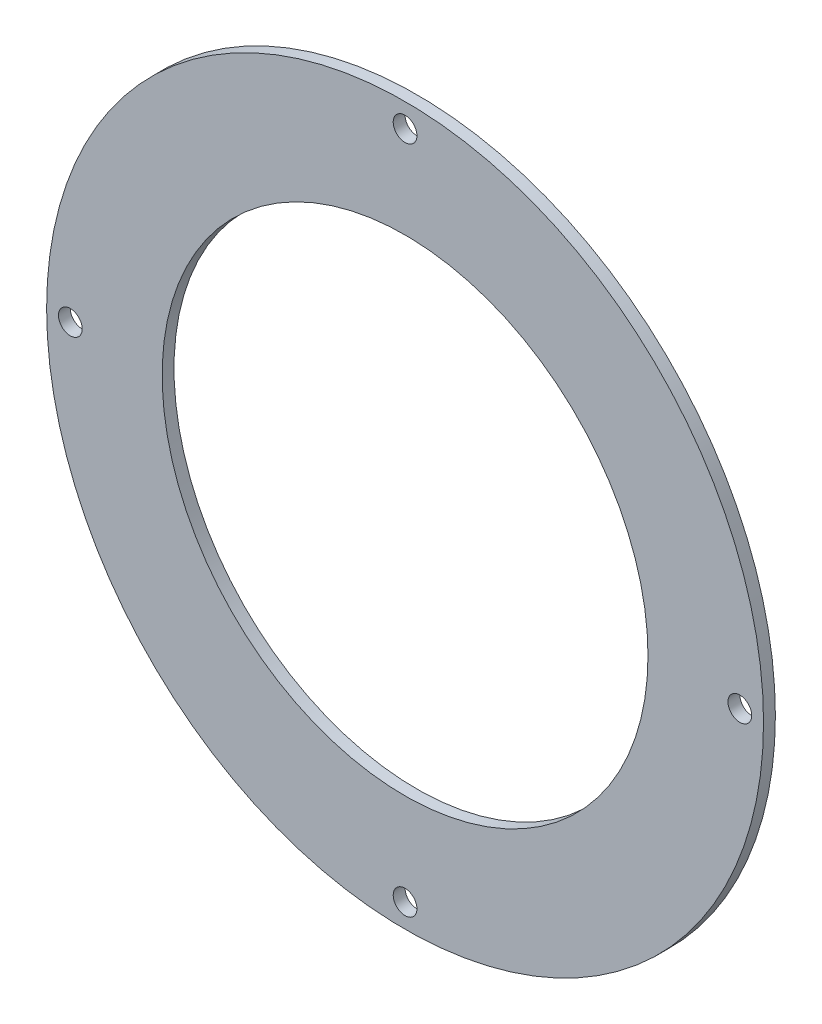
ISO-10303-21;
HEADER;
FILE_DESCRIPTION(('STEP AP214'),'2;1');
FILE_NAME('part.step','',(''),(''),'','','');
FILE_SCHEMA(('AUTOMOTIVE_DESIGN { 1 0 10303 214 1 1 1 1 }'));
ENDSEC;
DATA;
#1=APPLICATION_CONTEXT('core data for automotive mechanical design processes');
#2=APPLICATION_PROTOCOL_DEFINITION('international standard','automotive_design',2000,#1);
#3=PRODUCT_CONTEXT('',#1,'mechanical');
#4=PRODUCT('Part','Part','',(#3));
#5=PRODUCT_RELATED_PRODUCT_CATEGORY('part','',(#4));
#6=PRODUCT_DEFINITION_FORMATION('','',#4);
#7=PRODUCT_DEFINITION_CONTEXT('part definition',#1,'design');
#8=PRODUCT_DEFINITION('design','',#6,#7);
#9=PRODUCT_DEFINITION_SHAPE('','',#8);
#10=(LENGTH_UNIT() NAMED_UNIT(*) SI_UNIT(.MILLI.,.METRE.));
#11=(NAMED_UNIT(*) PLANE_ANGLE_UNIT() SI_UNIT($,.RADIAN.));
#12=(NAMED_UNIT(*) SI_UNIT($,.STERADIAN.) SOLID_ANGLE_UNIT());
#13=UNCERTAINTY_MEASURE_WITH_UNIT(LENGTH_MEASURE(1.E-05),#10,'distance_accuracy_value','');
#14=(GEOMETRIC_REPRESENTATION_CONTEXT(3) GLOBAL_UNCERTAINTY_ASSIGNED_CONTEXT((#13)) GLOBAL_UNIT_ASSIGNED_CONTEXT((#10,
#11,#12)) REPRESENTATION_CONTEXT('',''));
#15=CARTESIAN_POINT('',(0.,0.,0.));
#16=DIRECTION('',(0.,0.,1.));
#17=DIRECTION('',(1.,0.,0.));
#18=AXIS2_PLACEMENT_3D('',#15,#16,#17);
#19=CARTESIAN_POINT('',(0.,0.,2.));
#20=DIRECTION('',(0.,0.,1.));
#21=DIRECTION('',(1.,0.,0.));
#22=AXIS2_PLACEMENT_3D('',#19,#20,#21);
#23=PLANE('',#22);
#24=CARTESIAN_POINT('',(0.,0.,2.));
#25=DIRECTION('',(0.,0.,1.));
#26=DIRECTION('',(1.,0.,0.));
#27=AXIS2_PLACEMENT_3D('',#24,#25,#26);
#28=CIRCLE('',#27,41.);
#29=CARTESIAN_POINT('',(41.,0.,2.));
#30=VERTEX_POINT('',#29);
#31=EDGE_CURVE('E84',#30,#30,#28,.T.);
#32=ORIENTED_EDGE('',*,*,#31,.F.);
#33=EDGE_LOOP('',(#32));
#34=FACE_BOUND('',#33,.T.);
#35=CARTESIAN_POINT('',(3.94537391289274E-13,56.5,2.));
#36=DIRECTION('',(0.,0.,1.));
#37=DIRECTION('',(1.,0.,0.));
#38=AXIS2_PLACEMENT_3D('',#35,#36,#37);
#39=CIRCLE('',#38,2.);
#40=CARTESIAN_POINT('',(2.00000000000039,56.5,2.));
#41=VERTEX_POINT('',#40);
#42=EDGE_CURVE('E65',#41,#41,#39,.T.);
#43=ORIENTED_EDGE('',*,*,#42,.F.);
#44=EDGE_LOOP('',(#43));
#45=FACE_BOUND('',#44,.T.);
#46=CARTESIAN_POINT('',(0.,-56.5,2.));
#47=DIRECTION('',(0.,0.,1.));
#48=DIRECTION('',(1.,0.,0.));
#49=AXIS2_PLACEMENT_3D('',#46,#47,#48);
#50=CIRCLE('',#49,2.);
#51=CARTESIAN_POINT('',(2.,-56.5,2.));
#52=VERTEX_POINT('',#51);
#53=EDGE_CURVE('E51',#52,#52,#50,.T.);
#54=ORIENTED_EDGE('',*,*,#53,.F.);
#55=EDGE_LOOP('',(#54));
#56=FACE_BOUND('',#55,.T.);
#57=CARTESIAN_POINT('',(0.,0.,2.));
#58=DIRECTION('',(0.,0.,1.));
#59=DIRECTION('',(1.,0.,0.));
#60=AXIS2_PLACEMENT_3D('',#57,#58,#59);
#61=CIRCLE('',#60,60.5);
#62=CARTESIAN_POINT('',(60.5,0.,2.));
#63=VERTEX_POINT('',#62);
#64=EDGE_CURVE('E10',#63,#63,#61,.T.);
#65=ORIENTED_EDGE('',*,*,#64,.T.);
#66=EDGE_LOOP('',(#65));
#67=FACE_BOUND('',#66,.T.);
#68=CARTESIAN_POINT('',(-56.5,1.97268695644637E-13,2.));
#69=DIRECTION('',(0.,0.,1.));
#70=DIRECTION('',(1.,0.,0.));
#71=AXIS2_PLACEMENT_3D('',#68,#69,#70);
#72=CIRCLE('',#71,2.);
#73=CARTESIAN_POINT('',(-54.5,1.97268695644637E-13,2.));
#74=VERTEX_POINT('',#73);
#75=EDGE_CURVE('E57',#74,#74,#72,.T.);
#76=ORIENTED_EDGE('',*,*,#75,.F.);
#77=EDGE_LOOP('',(#76));
#78=FACE_BOUND('',#77,.T.);
#79=CARTESIAN_POINT('',(56.5,-5.91806086933911E-13,2.));
#80=DIRECTION('',(0.,0.,1.));
#81=DIRECTION('',(1.,0.,0.));
#82=AXIS2_PLACEMENT_3D('',#79,#80,#81);
#83=CIRCLE('',#82,2.);
#84=CARTESIAN_POINT('',(58.5,-5.91806086933911E-13,2.));
#85=VERTEX_POINT('',#84);
#86=EDGE_CURVE('E73',#85,#85,#83,.T.);
#87=ORIENTED_EDGE('',*,*,#86,.F.);
#88=EDGE_LOOP('',(#87));
#89=FACE_BOUND('',#88,.T.);
#90=ADVANCED_FACE('F36',(#34,#45,#56,#67,#78,#89),#23,.T.);
#91=CARTESIAN_POINT('',(0.,0.,0.));
#92=DIRECTION('',(0.,0.,1.));
#93=DIRECTION('',(1.,0.,0.));
#94=AXIS2_PLACEMENT_3D('',#91,#92,#93);
#95=PLANE('',#94);
#96=CARTESIAN_POINT('',(0.,0.,0.));
#97=DIRECTION('',(0.,0.,1.));
#98=DIRECTION('',(1.,0.,0.));
#99=AXIS2_PLACEMENT_3D('',#96,#97,#98);
#100=CIRCLE('',#99,41.);
#101=CARTESIAN_POINT('',(41.,0.,0.));
#102=VERTEX_POINT('',#101);
#103=EDGE_CURVE('E40',#102,#102,#100,.T.);
#104=ORIENTED_EDGE('',*,*,#103,.T.);
#105=EDGE_LOOP('',(#104));
#106=FACE_BOUND('',#105,.T.);
#107=CARTESIAN_POINT('',(0.,0.,0.));
#108=DIRECTION('',(0.,0.,1.));
#109=DIRECTION('',(1.,0.,0.));
#110=AXIS2_PLACEMENT_3D('',#107,#108,#109);
#111=CIRCLE('',#110,60.5);
#112=CARTESIAN_POINT('',(60.5,0.,0.));
#113=VERTEX_POINT('',#112);
#114=EDGE_CURVE('E45',#113,#113,#111,.T.);
#115=ORIENTED_EDGE('',*,*,#114,.F.);
#116=EDGE_LOOP('',(#115));
#117=FACE_BOUND('',#116,.T.);
#118=CARTESIAN_POINT('',(0.,-56.5,0.));
#119=DIRECTION('',(0.,0.,1.));
#120=DIRECTION('',(1.,0.,0.));
#121=AXIS2_PLACEMENT_3D('',#118,#119,#120);
#122=CIRCLE('',#121,2.);
#123=CARTESIAN_POINT('',(2.,-56.5,0.));
#124=VERTEX_POINT('',#123);
#125=EDGE_CURVE('E53',#124,#124,#122,.T.);
#126=ORIENTED_EDGE('',*,*,#125,.T.);
#127=EDGE_LOOP('',(#126));
#128=FACE_BOUND('',#127,.T.);
#129=CARTESIAN_POINT('',(-56.5,1.97268695644637E-13,0.));
#130=DIRECTION('',(0.,0.,1.));
#131=DIRECTION('',(1.,0.,0.));
#132=AXIS2_PLACEMENT_3D('',#129,#130,#131);
#133=CIRCLE('',#132,2.);
#134=CARTESIAN_POINT('',(-54.5,1.97268695644637E-13,0.));
#135=VERTEX_POINT('',#134);
#136=EDGE_CURVE('E61',#135,#135,#133,.T.);
#137=ORIENTED_EDGE('',*,*,#136,.T.);
#138=EDGE_LOOP('',(#137));
#139=FACE_BOUND('',#138,.T.);
#140=CARTESIAN_POINT('',(3.94537391289274E-13,56.5,0.));
#141=DIRECTION('',(0.,0.,1.));
#142=DIRECTION('',(1.,0.,0.));
#143=AXIS2_PLACEMENT_3D('',#140,#141,#142);
#144=CIRCLE('',#143,2.);
#145=CARTESIAN_POINT('',(2.00000000000039,56.5,0.));
#146=VERTEX_POINT('',#145);
#147=EDGE_CURVE('E69',#146,#146,#144,.T.);
#148=ORIENTED_EDGE('',*,*,#147,.T.);
#149=EDGE_LOOP('',(#148));
#150=FACE_BOUND('',#149,.T.);
#151=CARTESIAN_POINT('',(56.5,-5.91806086933911E-13,0.));
#152=DIRECTION('',(0.,0.,1.));
#153=DIRECTION('',(1.,0.,0.));
#154=AXIS2_PLACEMENT_3D('',#151,#152,#153);
#155=CIRCLE('',#154,2.);
#156=CARTESIAN_POINT('',(58.5,-5.91806086933911E-13,0.));
#157=VERTEX_POINT('',#156);
#158=EDGE_CURVE('E77',#157,#157,#155,.T.);
#159=ORIENTED_EDGE('',*,*,#158,.T.);
#160=EDGE_LOOP('',(#159));
#161=FACE_BOUND('',#160,.T.);
#162=ADVANCED_FACE('F93',(#106,#117,#128,#139,#150,#161),#95,.F.);
#163=CARTESIAN_POINT('',(0.,0.,2.));
#164=DIRECTION('',(0.,0.,-1.));
#165=DIRECTION('',(-1.,0.,0.));
#166=AXIS2_PLACEMENT_3D('',#163,#164,#165);
#167=CYLINDRICAL_SURFACE('',#166,60.5);
#168=ORIENTED_EDGE('',*,*,#64,.F.);
#169=EDGE_LOOP('',(#168));
#170=FACE_BOUND('',#169,.T.);
#171=ORIENTED_EDGE('',*,*,#114,.T.);
#172=EDGE_LOOP('',(#171));
#173=FACE_BOUND('',#172,.T.);
#174=ADVANCED_FACE('F38',(#170,#173),#167,.T.);
#175=CARTESIAN_POINT('',(0.,-56.5,2.));
#176=DIRECTION('',(0.,0.,-1.));
#177=DIRECTION('',(-1.,0.,0.));
#178=AXIS2_PLACEMENT_3D('',#175,#176,#177);
#179=CYLINDRICAL_SURFACE('',#178,2.);
#180=ORIENTED_EDGE('',*,*,#53,.T.);
#181=EDGE_LOOP('',(#180));
#182=FACE_BOUND('',#181,.T.);
#183=ORIENTED_EDGE('',*,*,#125,.F.);
#184=EDGE_LOOP('',(#183));
#185=FACE_BOUND('',#184,.T.);
#186=ADVANCED_FACE('F115',(#182,#185),#179,.F.);
#187=CARTESIAN_POINT('',(-56.5,1.97268695644637E-13,2.));
#188=DIRECTION('',(0.,0.,-1.));
#189=DIRECTION('',(-1.,0.,0.));
#190=AXIS2_PLACEMENT_3D('',#187,#188,#189);
#191=CYLINDRICAL_SURFACE('',#190,2.);
#192=ORIENTED_EDGE('',*,*,#75,.T.);
#193=EDGE_LOOP('',(#192));
#194=FACE_BOUND('',#193,.T.);
#195=ORIENTED_EDGE('',*,*,#136,.F.);
#196=EDGE_LOOP('',(#195));
#197=FACE_BOUND('',#196,.T.);
#198=ADVANCED_FACE('F118',(#194,#197),#191,.F.);
#199=CARTESIAN_POINT('',(3.94537391289274E-13,56.5,2.));
#200=DIRECTION('',(0.,0.,-1.));
#201=DIRECTION('',(-1.,0.,0.));
#202=AXIS2_PLACEMENT_3D('',#199,#200,#201);
#203=CYLINDRICAL_SURFACE('',#202,2.);
#204=ORIENTED_EDGE('',*,*,#42,.T.);
#205=EDGE_LOOP('',(#204));
#206=FACE_BOUND('',#205,.T.);
#207=ORIENTED_EDGE('',*,*,#147,.F.);
#208=EDGE_LOOP('',(#207));
#209=FACE_BOUND('',#208,.T.);
#210=ADVANCED_FACE('F103',(#206,#209),#203,.F.);
#211=CARTESIAN_POINT('',(56.5,-5.91806086933911E-13,2.));
#212=DIRECTION('',(0.,0.,-1.));
#213=DIRECTION('',(-1.,0.,0.));
#214=AXIS2_PLACEMENT_3D('',#211,#212,#213);
#215=CYLINDRICAL_SURFACE('',#214,2.);
#216=ORIENTED_EDGE('',*,*,#86,.T.);
#217=EDGE_LOOP('',(#216));
#218=FACE_BOUND('',#217,.T.);
#219=ORIENTED_EDGE('',*,*,#158,.F.);
#220=EDGE_LOOP('',(#219));
#221=FACE_BOUND('',#220,.T.);
#222=ADVANCED_FACE('F98',(#218,#221),#215,.F.);
#223=CARTESIAN_POINT('',(0.,0.,-8.));
#224=DIRECTION('',(0.,0.,1.));
#225=DIRECTION('',(1.,0.,0.));
#226=AXIS2_PLACEMENT_3D('',#223,#224,#225);
#227=CYLINDRICAL_SURFACE('',#226,41.);
#228=ORIENTED_EDGE('',*,*,#31,.T.);
#229=EDGE_LOOP('',(#228));
#230=FACE_BOUND('',#229,.T.);
#231=ORIENTED_EDGE('',*,*,#103,.F.);
#232=EDGE_LOOP('',(#231));
#233=FACE_BOUND('',#232,.T.);
#234=ADVANCED_FACE('F96',(#230,#233),#227,.F.);
#235=CLOSED_SHELL('',(#90,#162,#174,#186,#198,#210,#222,#234));
#236=MANIFOLD_SOLID_BREP('B2',#235);
#237=ADVANCED_BREP_SHAPE_REPRESENTATION('',(#18,#236),#14);
#238=SHAPE_DEFINITION_REPRESENTATION(#9,#237);
ENDSEC;
END-ISO-10303-21;
